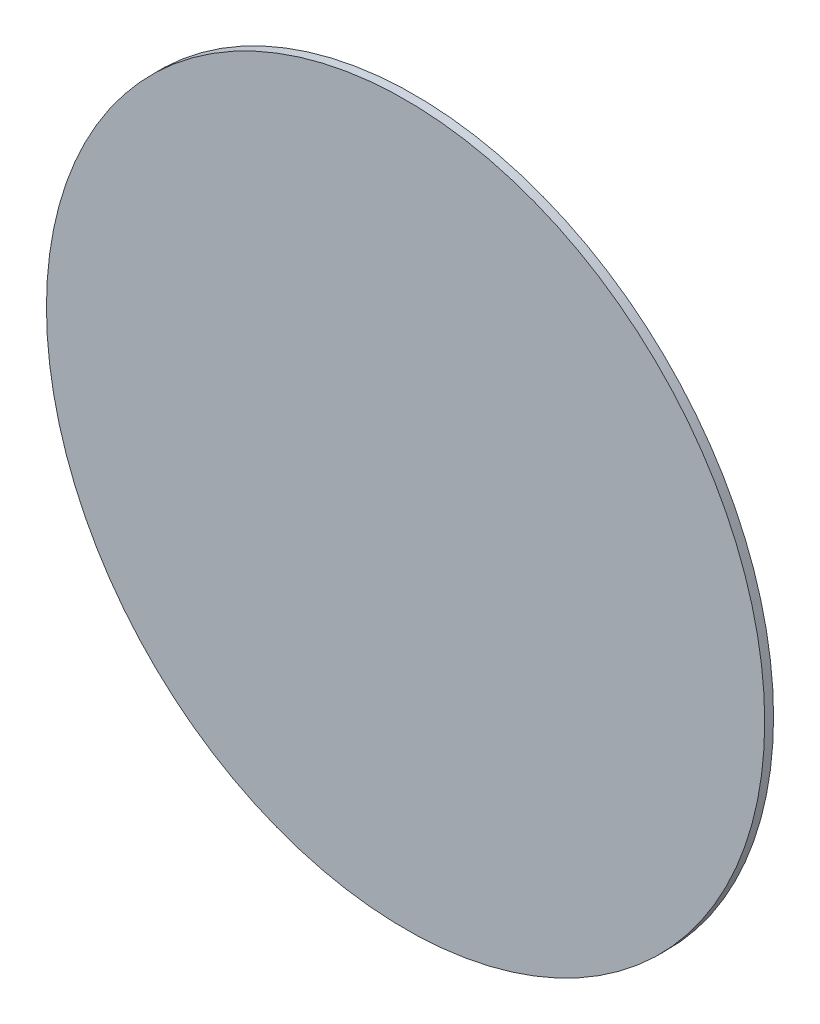
ISO-10303-21;
HEADER;
FILE_DESCRIPTION(('STEP AP214'),'2;1');
FILE_NAME('part.step','',(''),(''),'','','');
FILE_SCHEMA(('AUTOMOTIVE_DESIGN { 1 0 10303 214 1 1 1 1 }'));
ENDSEC;
DATA;
#1=APPLICATION_CONTEXT('core data for automotive mechanical design processes');
#2=APPLICATION_PROTOCOL_DEFINITION('international standard','automotive_design',2000,#1);
#3=PRODUCT_CONTEXT('',#1,'mechanical');
#4=PRODUCT('Part','Part','',(#3));
#5=PRODUCT_RELATED_PRODUCT_CATEGORY('part','',(#4));
#6=PRODUCT_DEFINITION_FORMATION('','',#4);
#7=PRODUCT_DEFINITION_CONTEXT('part definition',#1,'design');
#8=PRODUCT_DEFINITION('design','',#6,#7);
#9=PRODUCT_DEFINITION_SHAPE('','',#8);
#10=(LENGTH_UNIT() NAMED_UNIT(*) SI_UNIT(.MILLI.,.METRE.));
#11=(NAMED_UNIT(*) PLANE_ANGLE_UNIT() SI_UNIT($,.RADIAN.));
#12=(NAMED_UNIT(*) SI_UNIT($,.STERADIAN.) SOLID_ANGLE_UNIT());
#13=UNCERTAINTY_MEASURE_WITH_UNIT(LENGTH_MEASURE(1.E-05),#10,'distance_accuracy_value','');
#14=(GEOMETRIC_REPRESENTATION_CONTEXT(3) GLOBAL_UNCERTAINTY_ASSIGNED_CONTEXT((#13)) GLOBAL_UNIT_ASSIGNED_CONTEXT((#10,
#11,#12)) REPRESENTATION_CONTEXT('',''));
#15=CARTESIAN_POINT('',(0.,0.,0.));
#16=DIRECTION('',(0.,0.,1.));
#17=DIRECTION('',(1.,0.,0.));
#18=AXIS2_PLACEMENT_3D('',#15,#16,#17);
#19=CARTESIAN_POINT('',(0.,0.,1.6));
#20=DIRECTION('',(0.,0.,-1.));
#21=DIRECTION('',(-1.,0.,0.));
#22=AXIS2_PLACEMENT_3D('',#19,#20,#21);
#23=CYLINDRICAL_SURFACE('',#22,65.);
#24=CARTESIAN_POINT('',(0.,0.,1.6));
#25=DIRECTION('',(0.,0.,1.));
#26=DIRECTION('',(1.,0.,0.));
#27=AXIS2_PLACEMENT_3D('',#24,#25,#26);
#28=CIRCLE('',#27,65.);
#29=CARTESIAN_POINT('',(65.,0.,1.6));
#30=VERTEX_POINT('',#29);
#31=EDGE_CURVE('E10',#30,#30,#28,.T.);
#32=ORIENTED_EDGE('',*,*,#31,.F.);
#33=EDGE_LOOP('',(#32));
#34=FACE_BOUND('',#33,.T.);
#35=CARTESIAN_POINT('',(0.,0.,0.));
#36=DIRECTION('',(0.,0.,1.));
#37=DIRECTION('',(1.,0.,0.));
#38=AXIS2_PLACEMENT_3D('',#35,#36,#37);
#39=CIRCLE('',#38,65.);
#40=CARTESIAN_POINT('',(65.,0.,0.));
#41=VERTEX_POINT('',#40);
#42=EDGE_CURVE('E34',#41,#41,#39,.T.);
#43=ORIENTED_EDGE('',*,*,#42,.T.);
#44=EDGE_LOOP('',(#43));
#45=FACE_BOUND('',#44,.T.);
#46=ADVANCED_FACE('F31',(#34,#45),#23,.T.);
#47=CARTESIAN_POINT('',(0.,0.,1.6));
#48=DIRECTION('',(0.,0.,1.));
#49=DIRECTION('',(1.,0.,0.));
#50=AXIS2_PLACEMENT_3D('',#47,#48,#49);
#51=PLANE('',#50);
#52=ORIENTED_EDGE('',*,*,#31,.T.);
#53=EDGE_LOOP('',(#52));
#54=FACE_BOUND('',#53,.T.);
#55=ADVANCED_FACE('F46',(#54),#51,.T.);
#56=CARTESIAN_POINT('',(0.,0.,0.));
#57=DIRECTION('',(0.,0.,1.));
#58=DIRECTION('',(1.,0.,0.));
#59=AXIS2_PLACEMENT_3D('',#56,#57,#58);
#60=PLANE('',#59);
#61=ORIENTED_EDGE('',*,*,#42,.F.);
#62=EDGE_LOOP('',(#61));
#63=FACE_BOUND('',#62,.T.);
#64=ADVANCED_FACE('F44',(#63),#60,.F.);
#65=CLOSED_SHELL('',(#46,#55,#64));
#66=MANIFOLD_SOLID_BREP('B2',#65);
#67=ADVANCED_BREP_SHAPE_REPRESENTATION('',(#18,#66),#14);
#68=SHAPE_DEFINITION_REPRESENTATION(#9,#67);
ENDSEC;
END-ISO-10303-21;
